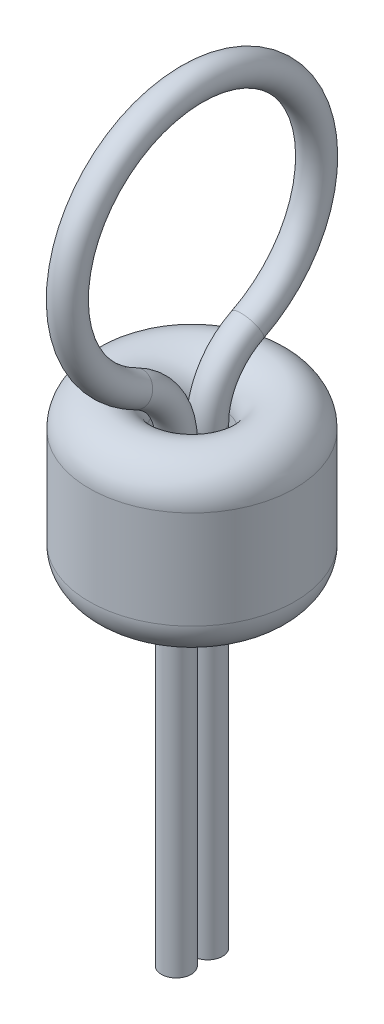
ISO-10303-21;
HEADER;
FILE_DESCRIPTION(('STEP AP214'),'2;1');
FILE_NAME('part.step','',(''),(''),'','','');
FILE_SCHEMA(('AUTOMOTIVE_DESIGN { 1 0 10303 214 1 1 1 1 }'));
ENDSEC;
DATA;
#1=APPLICATION_CONTEXT('core data for automotive mechanical design processes');
#2=APPLICATION_PROTOCOL_DEFINITION('international standard','automotive_design',2000,#1);
#3=PRODUCT_CONTEXT('',#1,'mechanical');
#4=PRODUCT('Part','Part','',(#3));
#5=PRODUCT_RELATED_PRODUCT_CATEGORY('part','',(#4));
#6=PRODUCT_DEFINITION_FORMATION('','',#4);
#7=PRODUCT_DEFINITION_CONTEXT('part definition',#1,'design');
#8=PRODUCT_DEFINITION('design','',#6,#7);
#9=PRODUCT_DEFINITION_SHAPE('','',#8);
#10=(LENGTH_UNIT() NAMED_UNIT(*) SI_UNIT(.MILLI.,.METRE.));
#11=(NAMED_UNIT(*) PLANE_ANGLE_UNIT() SI_UNIT($,.RADIAN.));
#12=(NAMED_UNIT(*) SI_UNIT($,.STERADIAN.) SOLID_ANGLE_UNIT());
#13=UNCERTAINTY_MEASURE_WITH_UNIT(LENGTH_MEASURE(1.E-05),#10,'distance_accuracy_value','');
#14=(GEOMETRIC_REPRESENTATION_CONTEXT(3) GLOBAL_UNCERTAINTY_ASSIGNED_CONTEXT((#13)) GLOBAL_UNIT_ASSIGNED_CONTEXT((#10,
#11,#12)) REPRESENTATION_CONTEXT('',''));
#15=CARTESIAN_POINT('',(0.,0.,0.));
#16=DIRECTION('',(0.,0.,1.));
#17=DIRECTION('',(1.,0.,0.));
#18=AXIS2_PLACEMENT_3D('',#15,#16,#17);
#19=CARTESIAN_POINT('',(0.,2.925,0.));
#20=DIRECTION('',(0.,-1.,0.));
#21=DIRECTION('',(0.,0.,-1.));
#22=AXIS2_PLACEMENT_3D('',#19,#20,#21);
#23=TOROIDAL_SURFACE('',#22,0.860000000000001,0.45);
#24=CARTESIAN_POINT('',(0.,2.925,0.));
#25=DIRECTION('',(0.,-1.,0.));
#26=DIRECTION('',(0.,0.,-1.));
#27=AXIS2_PLACEMENT_3D('',#24,#25,#26);
#28=CIRCLE('',#27,1.31);
#29=CARTESIAN_POINT('',(0.,2.925,-1.31));
#30=VERTEX_POINT('',#29);
#31=EDGE_CURVE('E11',#30,#30,#28,.T.);
#32=ORIENTED_EDGE('',*,*,#31,.F.);
#33=EDGE_LOOP('',(#32));
#34=FACE_BOUND('',#33,.T.);
#35=CARTESIAN_POINT('',(0.,2.925,0.));
#36=DIRECTION('',(0.,-1.,0.));
#37=DIRECTION('',(0.,0.,-1.));
#38=AXIS2_PLACEMENT_3D('',#35,#36,#37);
#39=CIRCLE('',#38,0.41);
#40=CARTESIAN_POINT('',(0.,2.925,-0.41));
#41=VERTEX_POINT('',#40);
#42=EDGE_CURVE('E63',#41,#41,#39,.T.);
#43=ORIENTED_EDGE('',*,*,#42,.T.);
#44=EDGE_LOOP('',(#43));
#45=FACE_BOUND('',#44,.T.);
#46=ADVANCED_FACE('F45',(#34,#45),#23,.T.);
#47=CARTESIAN_POINT('',(0.,0.,0.));
#48=DIRECTION('',(0.,-1.,0.));
#49=DIRECTION('',(0.,0.,-1.));
#50=AXIS2_PLACEMENT_3D('',#47,#48,#49);
#51=CYLINDRICAL_SURFACE('',#50,1.31);
#52=CARTESIAN_POINT('',(0.,1.675,0.));
#53=DIRECTION('',(0.,-1.,0.));
#54=DIRECTION('',(0.,0.,-1.));
#55=AXIS2_PLACEMENT_3D('',#52,#53,#54);
#56=CIRCLE('',#55,1.31);
#57=CARTESIAN_POINT('',(0.,1.675,-1.31));
#58=VERTEX_POINT('',#57);
#59=EDGE_CURVE('E52',#58,#58,#56,.T.);
#60=ORIENTED_EDGE('',*,*,#59,.F.);
#61=EDGE_LOOP('',(#60));
#62=FACE_BOUND('',#61,.T.);
#63=ORIENTED_EDGE('',*,*,#31,.T.);
#64=EDGE_LOOP('',(#63));
#65=FACE_BOUND('',#64,.T.);
#66=ADVANCED_FACE('F78',(#62,#65),#51,.T.);
#67=CARTESIAN_POINT('',(0.,1.675,0.));
#68=DIRECTION('',(0.,-1.,0.));
#69=DIRECTION('',(0.,0.,-1.));
#70=AXIS2_PLACEMENT_3D('',#67,#68,#69);
#71=TOROIDAL_SURFACE('',#70,0.86,0.45);
#72=CARTESIAN_POINT('',(0.,1.675,0.));
#73=DIRECTION('',(0.,-1.,0.));
#74=DIRECTION('',(0.,0.,-1.));
#75=AXIS2_PLACEMENT_3D('',#72,#73,#74);
#76=CIRCLE('',#75,0.41);
#77=CARTESIAN_POINT('',(0.,1.675,-0.41));
#78=VERTEX_POINT('',#77);
#79=EDGE_CURVE('E58',#78,#78,#76,.T.);
#80=ORIENTED_EDGE('',*,*,#79,.F.);
#81=EDGE_LOOP('',(#80));
#82=FACE_BOUND('',#81,.T.);
#83=ORIENTED_EDGE('',*,*,#59,.T.);
#84=EDGE_LOOP('',(#83));
#85=FACE_BOUND('',#84,.T.);
#86=ADVANCED_FACE('F73',(#82,#85),#71,.T.);
#87=CARTESIAN_POINT('',(0.,0.,0.));
#88=DIRECTION('',(0.,-1.,0.));
#89=DIRECTION('',(0.,0.,-1.));
#90=AXIS2_PLACEMENT_3D('',#87,#88,#89);
#91=CYLINDRICAL_SURFACE('',#90,0.41);
#92=ORIENTED_EDGE('',*,*,#42,.F.);
#93=EDGE_LOOP('',(#92));
#94=FACE_BOUND('',#93,.T.);
#95=ORIENTED_EDGE('',*,*,#79,.T.);
#96=EDGE_LOOP('',(#95));
#97=FACE_BOUND('',#96,.T.);
#98=ADVANCED_FACE('F70',(#94,#97),#91,.F.);
#99=CLOSED_SHELL('',(#46,#66,#86,#98));
#100=MANIFOLD_SOLID_BREP('B2',#99);
#101=CARTESIAN_POINT('',(0.,-2.90186821788358,-0.2));
#102=DIRECTION('',(0.,-1.,0.));
#103=DIRECTION('',(0.,0.,-1.));
#104=AXIS2_PLACEMENT_3D('',#101,#102,#103);
#105=PLANE('',#104);
#106=CARTESIAN_POINT('',(0.,-2.90186821788358,-0.2));
#107=DIRECTION('',(0.,-1.,0.));
#108=DIRECTION('',(0.,0.,-1.));
#109=AXIS2_PLACEMENT_3D('',#106,#107,#108);
#110=CIRCLE('',#109,0.19);
#111=CARTESIAN_POINT('',(0.,-2.90186821788358,-0.39));
#112=VERTEX_POINT('',#111);
#113=EDGE_CURVE('E143',#112,#112,#110,.T.);
#114=ORIENTED_EDGE('',*,*,#113,.T.);
#115=EDGE_LOOP('',(#114));
#116=FACE_BOUND('',#115,.T.);
#117=ADVANCED_FACE('F115',(#116),#105,.T.);
#118=CARTESIAN_POINT('',(0.,-2.90186821788358,0.2));
#119=DIRECTION('',(0.,1.,0.));
#120=DIRECTION('',(0.,0.,1.));
#121=AXIS2_PLACEMENT_3D('',#118,#119,#120);
#122=PLANE('',#121);
#123=CARTESIAN_POINT('',(0.,-2.90186821788358,0.2));
#124=DIRECTION('',(0.,1.,0.));
#125=DIRECTION('',(0.,0.,1.));
#126=AXIS2_PLACEMENT_3D('',#123,#124,#125);
#127=CIRCLE('',#126,0.19);
#128=CARTESIAN_POINT('',(0.,-2.90186821788358,0.39));
#129=VERTEX_POINT('',#128);
#130=EDGE_CURVE('E44',#129,#129,#127,.T.);
#131=ORIENTED_EDGE('',*,*,#130,.F.);
#132=EDGE_LOOP('',(#131));
#133=FACE_BOUND('',#132,.T.);
#134=ADVANCED_FACE('F151',(#133),#122,.F.);
#135=CARTESIAN_POINT('',(0.,-2.90186821788358,-0.2));
#136=DIRECTION('',(0.,1.,0.));
#137=DIRECTION('',(0.,0.,1.));
#138=AXIS2_PLACEMENT_3D('',#135,#136,#137);
#139=CYLINDRICAL_SURFACE('',#138,0.19);
#140=CARTESIAN_POINT('',(0.,2.90186821788358,-0.2));
#141=DIRECTION('',(0.,-1.,0.));
#142=DIRECTION('',(0.,0.,-1.));
#143=AXIS2_PLACEMENT_3D('',#140,#141,#142);
#144=CIRCLE('',#143,0.19);
#145=CARTESIAN_POINT('',(0.,2.90186821788358,-0.0100000000000013));
#146=VERTEX_POINT('',#145);
#147=EDGE_CURVE('E140',#146,#146,#144,.T.);
#148=ORIENTED_EDGE('',*,*,#147,.T.);
#149=EDGE_LOOP('',(#148));
#150=FACE_BOUND('',#149,.T.);
#151=ORIENTED_EDGE('',*,*,#113,.F.);
#152=EDGE_LOOP('',(#151));
#153=FACE_BOUND('',#152,.T.);
#154=ADVANCED_FACE('F148',(#150,#153),#139,.T.);
#155=CARTESIAN_POINT('',(0.,2.90186821788358,-1.12));
#156=DIRECTION('',(-1.,0.,0.));
#157=DIRECTION('',(0.,0.,1.));
#158=AXIS2_PLACEMENT_3D('',#155,#156,#157);
#159=TOROIDAL_SURFACE('',#158,0.92,0.19);
#160=CARTESIAN_POINT('',(0.,3.72519988286136,-0.709482071713148));
#161=DIRECTION('',(0.,-0.446215139442232,0.894925722801926));
#162=DIRECTION('',(0.,-0.894925722801926,-0.446215139442232));
#163=AXIS2_PLACEMENT_3D('',#160,#161,#162);
#164=CIRCLE('',#163,0.19);
#165=CARTESIAN_POINT('',(0.,3.89523577019372,-0.624701195219124));
#166=VERTEX_POINT('',#165);
#167=EDGE_CURVE('E135',#166,#166,#164,.T.);
#168=CARTESIAN_POINT('',(0.,2.90186821788358,-1.12));
#169=DIRECTION('',(-1.,0.,0.));
#170=DIRECTION('',(0.,0.,1.));
#171=AXIS2_PLACEMENT_3D('',#168,#169,#170);
#172=CIRCLE('',#171,1.11);
#173=EDGE_CURVE('',#146,#166,#172,.T.);
#174=ORIENTED_EDGE('',*,*,#147,.F.);
#175=ORIENTED_EDGE('',*,*,#167,.T.);
#176=ORIENTED_EDGE('',*,*,#173,.T.);
#177=ORIENTED_EDGE('',*,*,#173,.F.);
#178=EDGE_LOOP('',(#174,#176,#175,#177));
#179=FACE_BOUND('',#178,.T.);
#180=ADVANCED_FACE('F150',(#179),#159,.T.);
#181=CARTESIAN_POINT('',(0.,5.14813178211642,0.));
#182=DIRECTION('',(1.,0.,0.));
#183=DIRECTION('',(0.,0.,-1.));
#184=AXIS2_PLACEMENT_3D('',#181,#182,#183);
#185=TOROIDAL_SURFACE('',#184,1.59,0.19);
#186=CARTESIAN_POINT('',(0.,3.72519988286136,0.709482071713148));
#187=DIRECTION('',(0.,0.446215139442231,0.894925722801927));
#188=DIRECTION('',(0.,-0.894925722801927,0.446215139442231));
#189=AXIS2_PLACEMENT_3D('',#186,#187,#188);
#190=CIRCLE('',#189,0.19);
#191=CARTESIAN_POINT('',(0.,3.89523577019372,0.624701195219123));
#192=VERTEX_POINT('',#191);
#193=EDGE_CURVE('E129',#192,#192,#190,.T.);
#194=ORIENTED_EDGE('',*,*,#193,.T.);
#195=EDGE_LOOP('',(#194));
#196=FACE_BOUND('',#195,.T.);
#197=ORIENTED_EDGE('',*,*,#167,.F.);
#198=EDGE_LOOP('',(#197));
#199=FACE_BOUND('',#198,.T.);
#200=ADVANCED_FACE('F158',(#196,#199),#185,.T.);
#201=CARTESIAN_POINT('',(0.,2.90186821788358,1.12));
#202=DIRECTION('',(-1.,0.,0.));
#203=DIRECTION('',(0.,0.,1.));
#204=AXIS2_PLACEMENT_3D('',#201,#202,#203);
#205=TOROIDAL_SURFACE('',#204,0.92,0.19);
#206=CARTESIAN_POINT('',(0.,2.90186821788358,0.2));
#207=DIRECTION('',(0.,1.,0.));
#208=DIRECTION('',(0.,0.,1.));
#209=AXIS2_PLACEMENT_3D('',#206,#207,#208);
#210=CIRCLE('',#209,0.19);
#211=CARTESIAN_POINT('',(0.,2.90186821788358,0.01));
#212=VERTEX_POINT('',#211);
#213=EDGE_CURVE('E122',#212,#212,#210,.T.);
#214=CARTESIAN_POINT('',(0.,2.90186821788358,1.12));
#215=DIRECTION('',(-1.,0.,0.));
#216=DIRECTION('',(0.,0.,1.));
#217=AXIS2_PLACEMENT_3D('',#214,#215,#216);
#218=CIRCLE('',#217,1.11);
#219=EDGE_CURVE('',#192,#212,#218,.T.);
#220=ORIENTED_EDGE('',*,*,#193,.F.);
#221=ORIENTED_EDGE('',*,*,#213,.T.);
#222=ORIENTED_EDGE('',*,*,#219,.T.);
#223=ORIENTED_EDGE('',*,*,#219,.F.);
#224=EDGE_LOOP('',(#220,#222,#221,#223));
#225=FACE_BOUND('',#224,.T.);
#226=ADVANCED_FACE('F164',(#225),#205,.T.);
#227=CARTESIAN_POINT('',(0.,2.90186821788358,0.199999999999999));
#228=DIRECTION('',(0.,-1.,0.));
#229=DIRECTION('',(0.,0.,-1.));
#230=AXIS2_PLACEMENT_3D('',#227,#228,#229);
#231=CYLINDRICAL_SURFACE('',#230,0.19);
#232=ORIENTED_EDGE('',*,*,#130,.T.);
#233=EDGE_LOOP('',(#232));
#234=FACE_BOUND('',#233,.T.);
#235=ORIENTED_EDGE('',*,*,#213,.F.);
#236=EDGE_LOOP('',(#235));
#237=FACE_BOUND('',#236,.T.);
#238=ADVANCED_FACE('F162',(#234,#237),#231,.T.);
#239=CLOSED_SHELL('',(#117,#134,#154,#180,#200,#226,#238));
#240=MANIFOLD_SOLID_BREP('B6',#239);
#241=ADVANCED_BREP_SHAPE_REPRESENTATION('',(#18,#100,#240),#14);
#242=SHAPE_DEFINITION_REPRESENTATION(#9,#241);
ENDSEC;
END-ISO-10303-21;
